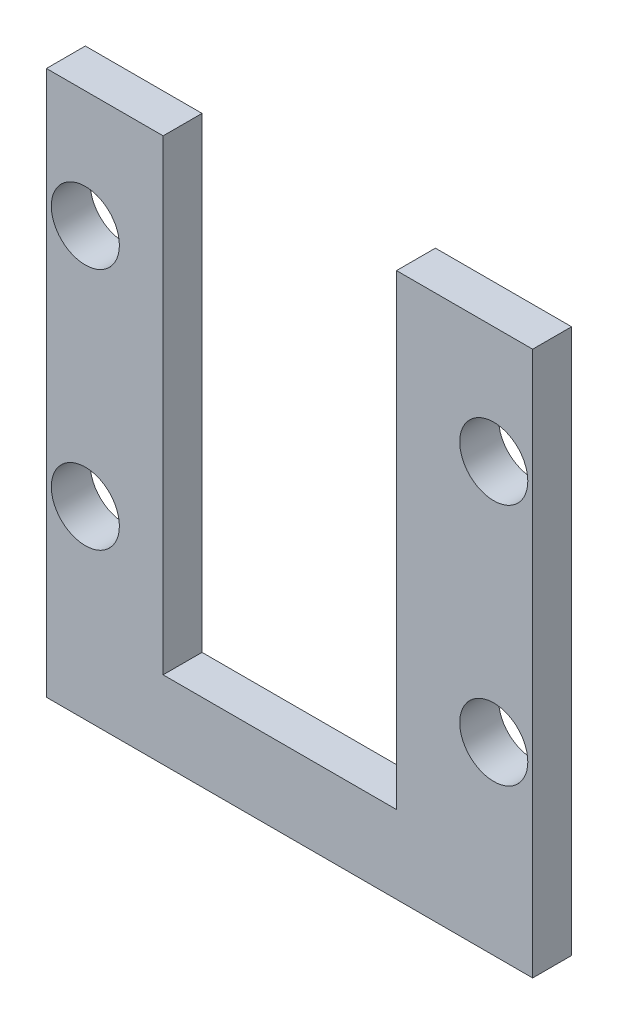
ISO-10303-21;
HEADER;
FILE_DESCRIPTION(('STEP AP214'),'2;1');
FILE_NAME('part.step','',(''),(''),'','','');
FILE_SCHEMA(('AUTOMOTIVE_DESIGN { 1 0 10303 214 1 1 1 1 }'));
ENDSEC;
DATA;
#1=APPLICATION_CONTEXT('core data for automotive mechanical design processes');
#2=APPLICATION_PROTOCOL_DEFINITION('international standard','automotive_design',2000,#1);
#3=PRODUCT_CONTEXT('',#1,'mechanical');
#4=PRODUCT('Part','Part','',(#3));
#5=PRODUCT_RELATED_PRODUCT_CATEGORY('part','',(#4));
#6=PRODUCT_DEFINITION_FORMATION('','',#4);
#7=PRODUCT_DEFINITION_CONTEXT('part definition',#1,'design');
#8=PRODUCT_DEFINITION('design','',#6,#7);
#9=PRODUCT_DEFINITION_SHAPE('','',#8);
#10=(LENGTH_UNIT() NAMED_UNIT(*) SI_UNIT(.MILLI.,.METRE.));
#11=(NAMED_UNIT(*) PLANE_ANGLE_UNIT() SI_UNIT($,.RADIAN.));
#12=(NAMED_UNIT(*) SI_UNIT($,.STERADIAN.) SOLID_ANGLE_UNIT());
#13=UNCERTAINTY_MEASURE_WITH_UNIT(LENGTH_MEASURE(1.E-05),#10,'distance_accuracy_value','');
#14=(GEOMETRIC_REPRESENTATION_CONTEXT(3) GLOBAL_UNCERTAINTY_ASSIGNED_CONTEXT((#13)) GLOBAL_UNIT_ASSIGNED_CONTEXT((#10,
#11,#12)) REPRESENTATION_CONTEXT('',''));
#15=CARTESIAN_POINT('',(0.,0.,0.));
#16=DIRECTION('',(0.,0.,1.));
#17=DIRECTION('',(1.,0.,0.));
#18=AXIS2_PLACEMENT_3D('',#15,#16,#17);
#19=CARTESIAN_POINT('',(25.,0.,2.));
#20=DIRECTION('',(-1.,0.,0.));
#21=DIRECTION('',(0.,-1.,0.));
#22=AXIS2_PLACEMENT_3D('',#19,#20,#21);
#23=PLANE('',#22);
#24=DIRECTION('',(0.,1.,0.));
#25=VECTOR('',#24,1.);
#26=CARTESIAN_POINT('',(25.,0.,0.));
#27=LINE('',#26,#25);
#28=CARTESIAN_POINT('',(25.,0.,0.));
#29=VERTEX_POINT('',#28);
#30=CARTESIAN_POINT('',(25.,28.,0.));
#31=VERTEX_POINT('',#30);
#32=EDGE_CURVE('E155',#29,#31,#27,.T.);
#33=ORIENTED_EDGE('',*,*,#32,.T.);
#34=DIRECTION('',(0.,0.,-1.));
#35=VECTOR('',#34,1.);
#36=CARTESIAN_POINT('',(25.,28.,2.));
#37=LINE('',#36,#35);
#38=CARTESIAN_POINT('',(25.,28.,2.));
#39=VERTEX_POINT('',#38);
#40=EDGE_CURVE('E11',#39,#31,#37,.T.);
#41=ORIENTED_EDGE('',*,*,#40,.F.);
#42=DIRECTION('',(0.,1.,0.));
#43=VECTOR('',#42,1.);
#44=CARTESIAN_POINT('',(25.,0.,2.));
#45=LINE('',#44,#43);
#46=CARTESIAN_POINT('',(25.,0.,2.));
#47=VERTEX_POINT('',#46);
#48=EDGE_CURVE('E93',#47,#39,#45,.T.);
#49=ORIENTED_EDGE('',*,*,#48,.F.);
#50=DIRECTION('',(0.,0.,-1.));
#51=VECTOR('',#50,1.);
#52=CARTESIAN_POINT('',(25.,0.,2.));
#53=LINE('',#52,#51);
#54=EDGE_CURVE('E135',#47,#29,#53,.T.);
#55=ORIENTED_EDGE('',*,*,#54,.T.);
#56=EDGE_LOOP('',(#33,#41,#49,#55));
#57=FACE_BOUND('',#56,.T.);
#58=ADVANCED_FACE('F39',(#57),#23,.F.);
#59=CARTESIAN_POINT('',(0.,28.,2.));
#60=DIRECTION('',(0.,1.,0.));
#61=DIRECTION('',(0.,0.,1.));
#62=AXIS2_PLACEMENT_3D('',#59,#60,#61);
#63=PLANE('',#62);
#64=DIRECTION('',(1.,0.,0.));
#65=VECTOR('',#64,1.);
#66=CARTESIAN_POINT('',(0.,28.,0.));
#67=LINE('',#66,#65);
#68=CARTESIAN_POINT('',(18.,28.,0.));
#69=VERTEX_POINT('',#68);
#70=EDGE_CURVE('E159',#69,#31,#67,.T.);
#71=ORIENTED_EDGE('',*,*,#70,.F.);
#72=DIRECTION('',(0.,0.,-1.));
#73=VECTOR('',#72,1.);
#74=CARTESIAN_POINT('',(18.,28.,2.));
#75=LINE('',#74,#73);
#76=CARTESIAN_POINT('',(18.,28.,2.));
#77=VERTEX_POINT('',#76);
#78=EDGE_CURVE('E49',#77,#69,#75,.T.);
#79=ORIENTED_EDGE('',*,*,#78,.F.);
#80=DIRECTION('',(1.,0.,0.));
#81=VECTOR('',#80,1.);
#82=CARTESIAN_POINT('',(0.,28.,2.));
#83=LINE('',#82,#81);
#84=EDGE_CURVE('E214',#77,#39,#83,.T.);
#85=ORIENTED_EDGE('',*,*,#84,.T.);
#86=ORIENTED_EDGE('',*,*,#40,.T.);
#87=EDGE_LOOP('',(#71,#79,#85,#86));
#88=FACE_BOUND('',#87,.T.);
#89=ADVANCED_FACE('F204',(#88),#63,.T.);
#90=CARTESIAN_POINT('',(18.,0.,2.));
#91=DIRECTION('',(-1.,0.,0.));
#92=DIRECTION('',(0.,0.,1.));
#93=AXIS2_PLACEMENT_3D('',#90,#91,#92);
#94=PLANE('',#93);
#95=DIRECTION('',(0.,1.,0.));
#96=VECTOR('',#95,1.);
#97=CARTESIAN_POINT('',(18.,0.,0.));
#98=LINE('',#97,#96);
#99=CARTESIAN_POINT('',(18.,4.,0.));
#100=VERTEX_POINT('',#99);
#101=EDGE_CURVE('E163',#100,#69,#98,.T.);
#102=ORIENTED_EDGE('',*,*,#101,.F.);
#103=DIRECTION('',(0.,0.,-1.));
#104=VECTOR('',#103,1.);
#105=CARTESIAN_POINT('',(18.,4.,2.));
#106=LINE('',#105,#104);
#107=CARTESIAN_POINT('',(18.,4.,2.));
#108=VERTEX_POINT('',#107);
#109=EDGE_CURVE('E192',#108,#100,#106,.T.);
#110=ORIENTED_EDGE('',*,*,#109,.F.);
#111=DIRECTION('',(0.,1.,0.));
#112=VECTOR('',#111,1.);
#113=CARTESIAN_POINT('',(18.,0.,2.));
#114=LINE('',#113,#112);
#115=EDGE_CURVE('E201',#108,#77,#114,.T.);
#116=ORIENTED_EDGE('',*,*,#115,.T.);
#117=ORIENTED_EDGE('',*,*,#78,.T.);
#118=EDGE_LOOP('',(#102,#110,#116,#117));
#119=FACE_BOUND('',#118,.T.);
#120=ADVANCED_FACE('F199',(#119),#94,.T.);
#121=CARTESIAN_POINT('',(0.,4.,2.));
#122=DIRECTION('',(0.,1.,0.));
#123=DIRECTION('',(0.,0.,1.));
#124=AXIS2_PLACEMENT_3D('',#121,#122,#123);
#125=PLANE('',#124);
#126=DIRECTION('',(1.,0.,0.));
#127=VECTOR('',#126,1.);
#128=CARTESIAN_POINT('',(0.,4.,0.));
#129=LINE('',#128,#127);
#130=CARTESIAN_POINT('',(6.,4.,0.));
#131=VERTEX_POINT('',#130);
#132=EDGE_CURVE('E167',#131,#100,#129,.T.);
#133=ORIENTED_EDGE('',*,*,#132,.F.);
#134=DIRECTION('',(0.,0.,-1.));
#135=VECTOR('',#134,1.);
#136=CARTESIAN_POINT('',(6.,4.,2.));
#137=LINE('',#136,#135);
#138=CARTESIAN_POINT('',(6.,4.,2.));
#139=VERTEX_POINT('',#138);
#140=EDGE_CURVE('E189',#139,#131,#137,.T.);
#141=ORIENTED_EDGE('',*,*,#140,.F.);
#142=DIRECTION('',(1.,0.,0.));
#143=VECTOR('',#142,1.);
#144=CARTESIAN_POINT('',(0.,4.,2.));
#145=LINE('',#144,#143);
#146=EDGE_CURVE('E213',#139,#108,#145,.T.);
#147=ORIENTED_EDGE('',*,*,#146,.T.);
#148=ORIENTED_EDGE('',*,*,#109,.T.);
#149=EDGE_LOOP('',(#133,#141,#147,#148));
#150=FACE_BOUND('',#149,.T.);
#151=ADVANCED_FACE('F211',(#150),#125,.T.);
#152=CARTESIAN_POINT('',(6.,0.,2.));
#153=DIRECTION('',(-1.,0.,0.));
#154=DIRECTION('',(0.,0.,1.));
#155=AXIS2_PLACEMENT_3D('',#152,#153,#154);
#156=PLANE('',#155);
#157=DIRECTION('',(0.,1.,0.));
#158=VECTOR('',#157,1.);
#159=CARTESIAN_POINT('',(6.,0.,0.));
#160=LINE('',#159,#158);
#161=CARTESIAN_POINT('',(6.,28.,0.));
#162=VERTEX_POINT('',#161);
#163=EDGE_CURVE('E171',#131,#162,#160,.T.);
#164=ORIENTED_EDGE('',*,*,#163,.T.);
#165=DIRECTION('',(0.,0.,-1.));
#166=VECTOR('',#165,1.);
#167=CARTESIAN_POINT('',(6.,28.,2.));
#168=LINE('',#167,#166);
#169=CARTESIAN_POINT('',(6.,28.,2.));
#170=VERTEX_POINT('',#169);
#171=EDGE_CURVE('E121',#170,#162,#168,.T.);
#172=ORIENTED_EDGE('',*,*,#171,.F.);
#173=DIRECTION('',(0.,1.,0.));
#174=VECTOR('',#173,1.);
#175=CARTESIAN_POINT('',(6.,0.,2.));
#176=LINE('',#175,#174);
#177=EDGE_CURVE('E127',#139,#170,#176,.T.);
#178=ORIENTED_EDGE('',*,*,#177,.F.);
#179=ORIENTED_EDGE('',*,*,#140,.T.);
#180=EDGE_LOOP('',(#164,#172,#178,#179));
#181=FACE_BOUND('',#180,.T.);
#182=ADVANCED_FACE('F299',(#181),#156,.F.);
#183=CARTESIAN_POINT('',(0.,28.,2.));
#184=DIRECTION('',(0.,1.,0.));
#185=DIRECTION('',(0.,0.,1.));
#186=AXIS2_PLACEMENT_3D('',#183,#184,#185);
#187=PLANE('',#186);
#188=DIRECTION('',(1.,0.,0.));
#189=VECTOR('',#188,1.);
#190=CARTESIAN_POINT('',(0.,28.,0.));
#191=LINE('',#190,#189);
#192=CARTESIAN_POINT('',(0.,28.,0.));
#193=VERTEX_POINT('',#192);
#194=EDGE_CURVE('E115',#193,#162,#191,.T.);
#195=ORIENTED_EDGE('',*,*,#194,.F.);
#196=DIRECTION('',(0.,0.,-1.));
#197=VECTOR('',#196,1.);
#198=CARTESIAN_POINT('',(0.,28.,2.));
#199=LINE('',#198,#197);
#200=CARTESIAN_POINT('',(0.,28.,2.));
#201=VERTEX_POINT('',#200);
#202=EDGE_CURVE('E110',#201,#193,#199,.T.);
#203=ORIENTED_EDGE('',*,*,#202,.F.);
#204=DIRECTION('',(1.,0.,0.));
#205=VECTOR('',#204,1.);
#206=CARTESIAN_POINT('',(0.,28.,2.));
#207=LINE('',#206,#205);
#208=EDGE_CURVE('E113',#201,#170,#207,.T.);
#209=ORIENTED_EDGE('',*,*,#208,.T.);
#210=ORIENTED_EDGE('',*,*,#171,.T.);
#211=EDGE_LOOP('',(#195,#203,#209,#210));
#212=FACE_BOUND('',#211,.T.);
#213=ADVANCED_FACE('F112',(#212),#187,.T.);
#214=CARTESIAN_POINT('',(0.,0.,2.));
#215=DIRECTION('',(-1.,0.,0.));
#216=DIRECTION('',(0.,-1.,0.));
#217=AXIS2_PLACEMENT_3D('',#214,#215,#216);
#218=PLANE('',#217);
#219=DIRECTION('',(0.,1.,0.));
#220=VECTOR('',#219,1.);
#221=CARTESIAN_POINT('',(0.,0.,0.));
#222=LINE('',#221,#220);
#223=CARTESIAN_POINT('',(0.,0.,0.));
#224=VERTEX_POINT('',#223);
#225=EDGE_CURVE('E177',#224,#193,#222,.T.);
#226=ORIENTED_EDGE('',*,*,#225,.F.);
#227=DIRECTION('',(0.,0.,-1.));
#228=VECTOR('',#227,1.);
#229=CARTESIAN_POINT('',(0.,0.,2.));
#230=LINE('',#229,#228);
#231=CARTESIAN_POINT('',(0.,0.,2.));
#232=VERTEX_POINT('',#231);
#233=EDGE_CURVE('E84',#232,#224,#230,.T.);
#234=ORIENTED_EDGE('',*,*,#233,.F.);
#235=DIRECTION('',(0.,1.,0.));
#236=VECTOR('',#235,1.);
#237=CARTESIAN_POINT('',(0.,0.,2.));
#238=LINE('',#237,#236);
#239=EDGE_CURVE('E124',#232,#201,#238,.T.);
#240=ORIENTED_EDGE('',*,*,#239,.T.);
#241=ORIENTED_EDGE('',*,*,#202,.T.);
#242=EDGE_LOOP('',(#226,#234,#240,#241));
#243=FACE_BOUND('',#242,.T.);
#244=ADVANCED_FACE('F131',(#243),#218,.T.);
#245=CARTESIAN_POINT('',(2.,22.,2.));
#246=DIRECTION('',(0.,0.,-1.));
#247=DIRECTION('',(-1.,0.,0.));
#248=AXIS2_PLACEMENT_3D('',#245,#246,#247);
#249=CYLINDRICAL_SURFACE('',#248,1.75);
#250=CARTESIAN_POINT('',(2.,22.,2.));
#251=DIRECTION('',(0.,0.,1.));
#252=DIRECTION('',(1.,0.,0.));
#253=AXIS2_PLACEMENT_3D('',#250,#251,#252);
#254=CIRCLE('',#253,1.75);
#255=CARTESIAN_POINT('',(3.75,22.,2.));
#256=VERTEX_POINT('',#255);
#257=EDGE_CURVE('E225',#256,#256,#254,.T.);
#258=ORIENTED_EDGE('',*,*,#257,.T.);
#259=EDGE_LOOP('',(#258));
#260=FACE_BOUND('',#259,.T.);
#261=CARTESIAN_POINT('',(2.,22.,0.));
#262=DIRECTION('',(0.,0.,1.));
#263=DIRECTION('',(1.,0.,0.));
#264=AXIS2_PLACEMENT_3D('',#261,#262,#263);
#265=CIRCLE('',#264,1.75);
#266=CARTESIAN_POINT('',(3.75,22.,0.));
#267=VERTEX_POINT('',#266);
#268=EDGE_CURVE('E151',#267,#267,#265,.T.);
#269=ORIENTED_EDGE('',*,*,#268,.F.);
#270=EDGE_LOOP('',(#269));
#271=FACE_BOUND('',#270,.T.);
#272=ADVANCED_FACE('F253',(#260,#271),#249,.F.);
#273=CARTESIAN_POINT('',(23.,22.,2.));
#274=DIRECTION('',(0.,0.,-1.));
#275=DIRECTION('',(-1.,0.,0.));
#276=AXIS2_PLACEMENT_3D('',#273,#274,#275);
#277=CYLINDRICAL_SURFACE('',#276,1.75);
#278=CARTESIAN_POINT('',(23.,22.,2.));
#279=DIRECTION('',(0.,0.,1.));
#280=DIRECTION('',(1.,0.,0.));
#281=AXIS2_PLACEMENT_3D('',#278,#279,#280);
#282=CIRCLE('',#281,1.75);
#283=CARTESIAN_POINT('',(24.75,22.,2.));
#284=VERTEX_POINT('',#283);
#285=EDGE_CURVE('E229',#284,#284,#282,.T.);
#286=ORIENTED_EDGE('',*,*,#285,.T.);
#287=EDGE_LOOP('',(#286));
#288=FACE_BOUND('',#287,.T.);
#289=CARTESIAN_POINT('',(23.,22.,0.));
#290=DIRECTION('',(0.,0.,1.));
#291=DIRECTION('',(1.,0.,0.));
#292=AXIS2_PLACEMENT_3D('',#289,#290,#291);
#293=CIRCLE('',#292,1.75);
#294=CARTESIAN_POINT('',(24.75,22.,0.));
#295=VERTEX_POINT('',#294);
#296=EDGE_CURVE('E147',#295,#295,#293,.T.);
#297=ORIENTED_EDGE('',*,*,#296,.F.);
#298=EDGE_LOOP('',(#297));
#299=FACE_BOUND('',#298,.T.);
#300=ADVANCED_FACE('F256',(#288,#299),#277,.F.);
#301=CARTESIAN_POINT('',(2.00000000000002,9.49999999999999,2.));
#302=DIRECTION('',(0.,0.,-1.));
#303=DIRECTION('',(-1.,0.,0.));
#304=AXIS2_PLACEMENT_3D('',#301,#302,#303);
#305=CYLINDRICAL_SURFACE('',#304,1.75);
#306=CARTESIAN_POINT('',(2.00000000000002,9.49999999999999,2.));
#307=DIRECTION('',(0.,0.,1.));
#308=DIRECTION('',(1.,0.,0.));
#309=AXIS2_PLACEMENT_3D('',#306,#307,#308);
#310=CIRCLE('',#309,1.75);
#311=CARTESIAN_POINT('',(3.75000000000002,9.49999999999999,2.));
#312=VERTEX_POINT('',#311);
#313=EDGE_CURVE('E233',#312,#312,#310,.T.);
#314=ORIENTED_EDGE('',*,*,#313,.T.);
#315=EDGE_LOOP('',(#314));
#316=FACE_BOUND('',#315,.T.);
#317=CARTESIAN_POINT('',(2.00000000000002,9.49999999999999,0.));
#318=DIRECTION('',(0.,0.,1.));
#319=DIRECTION('',(1.,0.,0.));
#320=AXIS2_PLACEMENT_3D('',#317,#318,#319);
#321=CIRCLE('',#320,1.75);
#322=CARTESIAN_POINT('',(3.75000000000002,9.49999999999999,0.));
#323=VERTEX_POINT('',#322);
#324=EDGE_CURVE('E143',#323,#323,#321,.T.);
#325=ORIENTED_EDGE('',*,*,#324,.F.);
#326=EDGE_LOOP('',(#325));
#327=FACE_BOUND('',#326,.T.);
#328=ADVANCED_FACE('F277',(#316,#327),#305,.F.);
#329=CARTESIAN_POINT('',(23.,9.49999999999999,2.));
#330=DIRECTION('',(0.,0.,-1.));
#331=DIRECTION('',(-1.,0.,0.));
#332=AXIS2_PLACEMENT_3D('',#329,#330,#331);
#333=CYLINDRICAL_SURFACE('',#332,1.75);
#334=CARTESIAN_POINT('',(23.,9.49999999999999,2.));
#335=DIRECTION('',(0.,0.,1.));
#336=DIRECTION('',(1.,0.,0.));
#337=AXIS2_PLACEMENT_3D('',#334,#335,#336);
#338=CIRCLE('',#337,1.75);
#339=CARTESIAN_POINT('',(24.75,9.49999999999999,2.));
#340=VERTEX_POINT('',#339);
#341=EDGE_CURVE('E182',#340,#340,#338,.T.);
#342=ORIENTED_EDGE('',*,*,#341,.T.);
#343=EDGE_LOOP('',(#342));
#344=FACE_BOUND('',#343,.T.);
#345=CARTESIAN_POINT('',(23.,9.49999999999999,0.));
#346=DIRECTION('',(0.,0.,1.));
#347=DIRECTION('',(1.,0.,0.));
#348=AXIS2_PLACEMENT_3D('',#345,#346,#347);
#349=CIRCLE('',#348,1.75);
#350=CARTESIAN_POINT('',(24.75,9.49999999999999,0.));
#351=VERTEX_POINT('',#350);
#352=EDGE_CURVE('E139',#351,#351,#349,.T.);
#353=ORIENTED_EDGE('',*,*,#352,.F.);
#354=EDGE_LOOP('',(#353));
#355=FACE_BOUND('',#354,.T.);
#356=ADVANCED_FACE('F41',(#344,#355),#333,.F.);
#357=CARTESIAN_POINT('',(0.,0.,2.));
#358=DIRECTION('',(0.,1.,0.));
#359=DIRECTION('',(0.,0.,1.));
#360=AXIS2_PLACEMENT_3D('',#357,#358,#359);
#361=PLANE('',#360);
#362=DIRECTION('',(1.,0.,0.));
#363=VECTOR('',#362,1.);
#364=CARTESIAN_POINT('',(0.,0.,0.));
#365=LINE('',#364,#363);
#366=EDGE_CURVE('E87',#224,#29,#365,.T.);
#367=ORIENTED_EDGE('',*,*,#366,.T.);
#368=ORIENTED_EDGE('',*,*,#54,.F.);
#369=DIRECTION('',(1.,0.,0.));
#370=VECTOR('',#369,1.);
#371=CARTESIAN_POINT('',(0.,0.,2.));
#372=LINE('',#371,#370);
#373=EDGE_CURVE('E57',#232,#47,#372,.T.);
#374=ORIENTED_EDGE('',*,*,#373,.F.);
#375=ORIENTED_EDGE('',*,*,#233,.T.);
#376=EDGE_LOOP('',(#367,#368,#374,#375));
#377=FACE_BOUND('',#376,.T.);
#378=ADVANCED_FACE('F245',(#377),#361,.F.);
#379=CARTESIAN_POINT('',(0.,0.,2.));
#380=DIRECTION('',(0.,0.,1.));
#381=DIRECTION('',(1.,0.,0.));
#382=AXIS2_PLACEMENT_3D('',#379,#380,#381);
#383=PLANE('',#382);
#384=ORIENTED_EDGE('',*,*,#341,.F.);
#385=EDGE_LOOP('',(#384));
#386=FACE_BOUND('',#385,.T.);
#387=ORIENTED_EDGE('',*,*,#313,.F.);
#388=EDGE_LOOP('',(#387));
#389=FACE_BOUND('',#388,.T.);
#390=ORIENTED_EDGE('',*,*,#285,.F.);
#391=EDGE_LOOP('',(#390));
#392=FACE_BOUND('',#391,.T.);
#393=ORIENTED_EDGE('',*,*,#257,.F.);
#394=EDGE_LOOP('',(#393));
#395=FACE_BOUND('',#394,.T.);
#396=ORIENTED_EDGE('',*,*,#48,.T.);
#397=ORIENTED_EDGE('',*,*,#84,.F.);
#398=ORIENTED_EDGE('',*,*,#115,.F.);
#399=ORIENTED_EDGE('',*,*,#146,.F.);
#400=ORIENTED_EDGE('',*,*,#177,.T.);
#401=ORIENTED_EDGE('',*,*,#208,.F.);
#402=ORIENTED_EDGE('',*,*,#239,.F.);
#403=ORIENTED_EDGE('',*,*,#373,.T.);
#404=EDGE_LOOP('',(#396,#397,#398,#399,#400,#401,#402,#403));
#405=FACE_BOUND('',#404,.T.);
#406=ADVANCED_FACE('F123',(#386,#389,#392,#395,#405),#383,.T.);
#407=CARTESIAN_POINT('',(0.,0.,0.));
#408=DIRECTION('',(0.,0.,1.));
#409=DIRECTION('',(1.,0.,0.));
#410=AXIS2_PLACEMENT_3D('',#407,#408,#409);
#411=PLANE('',#410);
#412=ORIENTED_EDGE('',*,*,#352,.T.);
#413=EDGE_LOOP('',(#412));
#414=FACE_BOUND('',#413,.T.);
#415=ORIENTED_EDGE('',*,*,#324,.T.);
#416=EDGE_LOOP('',(#415));
#417=FACE_BOUND('',#416,.T.);
#418=ORIENTED_EDGE('',*,*,#296,.T.);
#419=EDGE_LOOP('',(#418));
#420=FACE_BOUND('',#419,.T.);
#421=ORIENTED_EDGE('',*,*,#268,.T.);
#422=EDGE_LOOP('',(#421));
#423=FACE_BOUND('',#422,.T.);
#424=ORIENTED_EDGE('',*,*,#32,.F.);
#425=ORIENTED_EDGE('',*,*,#366,.F.);
#426=ORIENTED_EDGE('',*,*,#225,.T.);
#427=ORIENTED_EDGE('',*,*,#194,.T.);
#428=ORIENTED_EDGE('',*,*,#163,.F.);
#429=ORIENTED_EDGE('',*,*,#132,.T.);
#430=ORIENTED_EDGE('',*,*,#101,.T.);
#431=ORIENTED_EDGE('',*,*,#70,.T.);
#432=EDGE_LOOP('',(#424,#425,#426,#427,#428,#429,#430,#431));
#433=FACE_BOUND('',#432,.T.);
#434=ADVANCED_FACE('F207',(#414,#417,#420,#423,#433),#411,.F.);
#435=CLOSED_SHELL('',(#58,#89,#120,#151,#182,#213,#244,#272,#300,#328,#356,#378,#406,#434));
#436=MANIFOLD_SOLID_BREP('B2',#435);
#437=ADVANCED_BREP_SHAPE_REPRESENTATION('',(#18,#436),#14);
#438=SHAPE_DEFINITION_REPRESENTATION(#9,#437);
ENDSEC;
END-ISO-10303-21;
